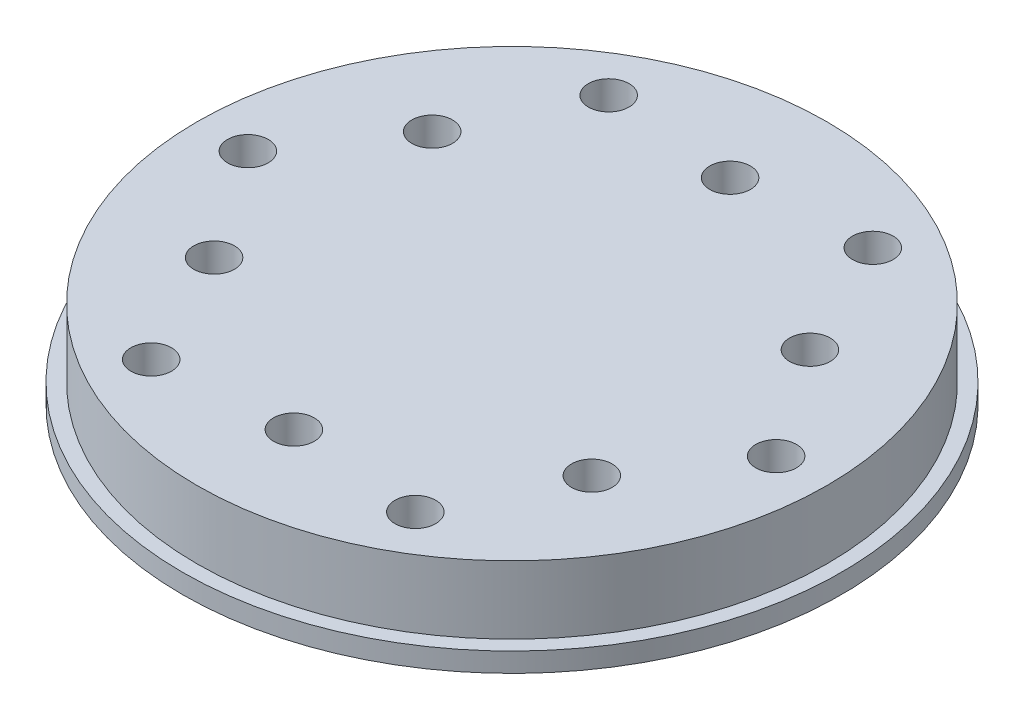
ISO-10303-21;
HEADER;
FILE_DESCRIPTION(('STEP AP214'),'2;1');
FILE_NAME('part.step','',(''),(''),'','','');
FILE_SCHEMA(('AUTOMOTIVE_DESIGN { 1 0 10303 214 1 1 1 1 }'));
ENDSEC;
DATA;
#1=APPLICATION_CONTEXT('core data for automotive mechanical design processes');
#2=APPLICATION_PROTOCOL_DEFINITION('international standard','automotive_design',2000,#1);
#3=PRODUCT_CONTEXT('',#1,'mechanical');
#4=PRODUCT('Part','Part','',(#3));
#5=PRODUCT_RELATED_PRODUCT_CATEGORY('part','',(#4));
#6=PRODUCT_DEFINITION_FORMATION('','',#4);
#7=PRODUCT_DEFINITION_CONTEXT('part definition',#1,'design');
#8=PRODUCT_DEFINITION('design','',#6,#7);
#9=PRODUCT_DEFINITION_SHAPE('','',#8);
#10=(LENGTH_UNIT() NAMED_UNIT(*) SI_UNIT(.MILLI.,.METRE.));
#11=(NAMED_UNIT(*) PLANE_ANGLE_UNIT() SI_UNIT($,.RADIAN.));
#12=(NAMED_UNIT(*) SI_UNIT($,.STERADIAN.) SOLID_ANGLE_UNIT());
#13=UNCERTAINTY_MEASURE_WITH_UNIT(LENGTH_MEASURE(1.E-05),#10,'distance_accuracy_value','');
#14=(GEOMETRIC_REPRESENTATION_CONTEXT(3) GLOBAL_UNCERTAINTY_ASSIGNED_CONTEXT((#13)) GLOBAL_UNIT_ASSIGNED_CONTEXT((#10,
#11,#12)) REPRESENTATION_CONTEXT('',''));
#15=CARTESIAN_POINT('',(0.,0.,0.));
#16=DIRECTION('',(0.,0.,1.));
#17=DIRECTION('',(1.,0.,0.));
#18=AXIS2_PLACEMENT_3D('',#15,#16,#17);
#19=CARTESIAN_POINT('',(0.,10.,0.));
#20=DIRECTION('',(0.,-1.,0.));
#21=DIRECTION('',(0.,0.,-1.));
#22=AXIS2_PLACEMENT_3D('',#19,#20,#21);
#23=CYLINDRICAL_SURFACE('',#22,32.5);
#24=CARTESIAN_POINT('',(0.,10.,0.));
#25=DIRECTION('',(0.,1.,0.));
#26=DIRECTION('',(0.,0.,1.));
#27=AXIS2_PLACEMENT_3D('',#24,#25,#26);
#28=CIRCLE('',#27,32.5);
#29=CARTESIAN_POINT('',(0.,10.,32.5));
#30=VERTEX_POINT('',#29);
#31=EDGE_CURVE('E45',#30,#30,#28,.T.);
#32=ORIENTED_EDGE('',*,*,#31,.F.);
#33=EDGE_LOOP('',(#32));
#34=FACE_BOUND('',#33,.T.);
#35=CARTESIAN_POINT('',(0.,2.99999999999996,0.));
#36=DIRECTION('',(0.,-1.,0.));
#37=DIRECTION('',(0.,0.,-1.));
#38=AXIS2_PLACEMENT_3D('',#35,#36,#37);
#39=CIRCLE('',#38,32.5);
#40=CARTESIAN_POINT('',(0.,2.99999999999991,-32.5));
#41=VERTEX_POINT('',#40);
#42=EDGE_CURVE('E10',#41,#41,#39,.T.);
#43=ORIENTED_EDGE('',*,*,#42,.F.);
#44=EDGE_LOOP('',(#43));
#45=FACE_BOUND('',#44,.T.);
#46=ADVANCED_FACE('F38',(#34,#45),#23,.T.);
#47=CARTESIAN_POINT('',(0.,0.,0.));
#48=DIRECTION('',(0.,1.,0.));
#49=DIRECTION('',(0.,0.,1.));
#50=AXIS2_PLACEMENT_3D('',#47,#48,#49);
#51=PLANE('',#50);
#52=CARTESIAN_POINT('',(0.,0.,0.));
#53=DIRECTION('',(0.,1.,0.));
#54=DIRECTION('',(0.,0.,1.));
#55=AXIS2_PLACEMENT_3D('',#52,#53,#54);
#56=CIRCLE('',#55,6.5);
#57=CARTESIAN_POINT('',(0.,0.,6.5));
#58=VERTEX_POINT('',#57);
#59=EDGE_CURVE('E49',#58,#58,#56,.T.);
#60=ORIENTED_EDGE('',*,*,#59,.T.);
#61=EDGE_LOOP('',(#60));
#62=FACE_BOUND('',#61,.T.);
#63=CARTESIAN_POINT('',(0.,0.,0.));
#64=DIRECTION('',(0.,-1.,0.));
#65=DIRECTION('',(0.,0.,-1.));
#66=AXIS2_PLACEMENT_3D('',#63,#64,#65);
#67=CIRCLE('',#66,17.5);
#68=CARTESIAN_POINT('',(0.,0.,-17.5));
#69=VERTEX_POINT('',#68);
#70=EDGE_CURVE('E94',#69,#69,#67,.T.);
#71=ORIENTED_EDGE('',*,*,#70,.T.);
#72=EDGE_LOOP('',(#71));
#73=FACE_BOUND('',#72,.T.);
#74=ADVANCED_FACE('F173',(#62,#73),#51,.F.);
#75=CARTESIAN_POINT('',(0.,10.,0.));
#76=DIRECTION('',(0.,-1.,0.));
#77=DIRECTION('',(0.,0.,-1.));
#78=AXIS2_PLACEMENT_3D('',#75,#76,#77);
#79=CYLINDRICAL_SURFACE('',#78,6.5);
#80=ORIENTED_EDGE('',*,*,#59,.F.);
#81=EDGE_LOOP('',(#80));
#82=FACE_BOUND('',#81,.T.);
#83=CARTESIAN_POINT('',(0.,3.5,0.));
#84=DIRECTION('',(0.,1.,0.));
#85=DIRECTION('',(0.,0.,1.));
#86=AXIS2_PLACEMENT_3D('',#83,#84,#85);
#87=CIRCLE('',#86,6.5);
#88=CARTESIAN_POINT('',(0.,3.5,6.5));
#89=VERTEX_POINT('',#88);
#90=EDGE_CURVE('E77',#89,#89,#87,.T.);
#91=ORIENTED_EDGE('',*,*,#90,.T.);
#92=EDGE_LOOP('',(#91));
#93=FACE_BOUND('',#92,.T.);
#94=ADVANCED_FACE('F177',(#82,#93),#79,.F.);
#95=CARTESIAN_POINT('',(0.,3.5,0.));
#96=DIRECTION('',(0.,1.,0.));
#97=DIRECTION('',(0.,0.,1.));
#98=AXIS2_PLACEMENT_3D('',#95,#96,#97);
#99=PLANE('',#98);
#100=ORIENTED_EDGE('',*,*,#90,.F.);
#101=EDGE_LOOP('',(#100));
#102=FACE_BOUND('',#101,.T.);
#103=ADVANCED_FACE('F182',(#102),#99,.F.);
#104=CARTESIAN_POINT('',(0.,1.,0.));
#105=DIRECTION('',(0.,-1.,0.));
#106=DIRECTION('',(0.,0.,-1.));
#107=AXIS2_PLACEMENT_3D('',#104,#105,#106);
#108=PLANE('',#107);
#109=CARTESIAN_POINT('',(0.,0.999999999999999,-22.5));
#110=DIRECTION('',(0.,-1.,0.));
#111=DIRECTION('',(0.,0.,-1.));
#112=AXIS2_PLACEMENT_3D('',#109,#110,#111);
#113=CIRCLE('',#112,2.1);
#114=CARTESIAN_POINT('',(0.,0.999999999999999,-24.6));
#115=VERTEX_POINT('',#114);
#116=EDGE_CURVE('E132',#115,#115,#113,.T.);
#117=ORIENTED_EDGE('',*,*,#116,.F.);
#118=EDGE_LOOP('',(#117));
#119=FACE_BOUND('',#118,.T.);
#120=CARTESIAN_POINT('',(19.4855715851499,0.999999999999999,-11.25));
#121=DIRECTION('',(0.,-1.,0.));
#122=DIRECTION('',(0.,0.,-1.));
#123=AXIS2_PLACEMENT_3D('',#120,#121,#122);
#124=CIRCLE('',#123,2.1);
#125=CARTESIAN_POINT('',(19.4855715851499,0.999999999999999,-13.35));
#126=VERTEX_POINT('',#125);
#127=EDGE_CURVE('E126',#126,#126,#124,.T.);
#128=ORIENTED_EDGE('',*,*,#127,.F.);
#129=EDGE_LOOP('',(#128));
#130=FACE_BOUND('',#129,.T.);
#131=CARTESIAN_POINT('',(19.4855715851499,0.999999999999999,11.25));
#132=DIRECTION('',(0.,-1.,0.));
#133=DIRECTION('',(0.,0.,-1.));
#134=AXIS2_PLACEMENT_3D('',#131,#132,#133);
#135=CIRCLE('',#134,2.1);
#136=CARTESIAN_POINT('',(19.4855715851499,0.999999999999999,9.15));
#137=VERTEX_POINT('',#136);
#138=EDGE_CURVE('E120',#137,#137,#135,.T.);
#139=ORIENTED_EDGE('',*,*,#138,.F.);
#140=EDGE_LOOP('',(#139));
#141=FACE_BOUND('',#140,.T.);
#142=CARTESIAN_POINT('',(0.,0.999999999999999,22.5));
#143=DIRECTION('',(0.,-1.,0.));
#144=DIRECTION('',(0.,0.,-1.));
#145=AXIS2_PLACEMENT_3D('',#142,#143,#144);
#146=CIRCLE('',#145,2.1);
#147=CARTESIAN_POINT('',(0.,0.999999999999999,20.4));
#148=VERTEX_POINT('',#147);
#149=EDGE_CURVE('E114',#148,#148,#146,.T.);
#150=ORIENTED_EDGE('',*,*,#149,.F.);
#151=EDGE_LOOP('',(#150));
#152=FACE_BOUND('',#151,.T.);
#153=CARTESIAN_POINT('',(-19.4855715851499,0.999999999999999,11.25));
#154=DIRECTION('',(0.,-1.,0.));
#155=DIRECTION('',(0.,0.,-1.));
#156=AXIS2_PLACEMENT_3D('',#153,#154,#155);
#157=CIRCLE('',#156,2.1);
#158=CARTESIAN_POINT('',(-19.4855715851499,0.999999999999999,9.15000000000001));
#159=VERTEX_POINT('',#158);
#160=EDGE_CURVE('E108',#159,#159,#157,.T.);
#161=ORIENTED_EDGE('',*,*,#160,.F.);
#162=EDGE_LOOP('',(#161));
#163=FACE_BOUND('',#162,.T.);
#164=CARTESIAN_POINT('',(-19.4855715851499,0.999999999999999,-11.25));
#165=DIRECTION('',(0.,-1.,0.));
#166=DIRECTION('',(0.,0.,-1.));
#167=AXIS2_PLACEMENT_3D('',#164,#165,#166);
#168=CIRCLE('',#167,2.1);
#169=CARTESIAN_POINT('',(-19.4855715851499,0.999999999999999,-13.35));
#170=VERTEX_POINT('',#169);
#171=EDGE_CURVE('E41',#170,#170,#168,.T.);
#172=ORIENTED_EDGE('',*,*,#171,.F.);
#173=EDGE_LOOP('',(#172));
#174=FACE_BOUND('',#173,.T.);
#175=CARTESIAN_POINT('',(0.,1.,0.));
#176=DIRECTION('',(0.,-1.,0.));
#177=DIRECTION('',(0.,0.,-1.));
#178=AXIS2_PLACEMENT_3D('',#175,#176,#177);
#179=CIRCLE('',#178,17.5);
#180=CARTESIAN_POINT('',(0.,1.,-17.5));
#181=VERTEX_POINT('',#180);
#182=EDGE_CURVE('E55',#181,#181,#179,.T.);
#183=ORIENTED_EDGE('',*,*,#182,.F.);
#184=EDGE_LOOP('',(#183));
#185=FACE_BOUND('',#184,.T.);
#186=CARTESIAN_POINT('',(-13.625,0.999999999999999,-23.5991922531259));
#187=DIRECTION('',(0.,-1.,0.));
#188=DIRECTION('',(0.,0.,-1.));
#189=AXIS2_PLACEMENT_3D('',#186,#187,#188);
#190=CIRCLE('',#189,2.1);
#191=CARTESIAN_POINT('',(-13.625,0.999999999999999,-25.6991922531259));
#192=VERTEX_POINT('',#191);
#193=EDGE_CURVE('E52',#192,#192,#190,.F.);
#194=ORIENTED_EDGE('',*,*,#193,.T.);
#195=EDGE_LOOP('',(#194));
#196=FACE_BOUND('',#195,.T.);
#197=CARTESIAN_POINT('',(13.625,0.999999999999999,-23.599192253126));
#198=DIRECTION('',(0.,-1.,0.));
#199=DIRECTION('',(0.,0.,-1.));
#200=AXIS2_PLACEMENT_3D('',#197,#198,#199);
#201=CIRCLE('',#200,2.1);
#202=CARTESIAN_POINT('',(13.625,0.999999999999999,-25.699192253126));
#203=VERTEX_POINT('',#202);
#204=EDGE_CURVE('E54',#203,#203,#201,.F.);
#205=ORIENTED_EDGE('',*,*,#204,.T.);
#206=EDGE_LOOP('',(#205));
#207=FACE_BOUND('',#206,.T.);
#208=CARTESIAN_POINT('',(27.25,0.999999999999999,0.));
#209=DIRECTION('',(0.,-1.,0.));
#210=DIRECTION('',(0.,0.,-1.));
#211=AXIS2_PLACEMENT_3D('',#208,#209,#210);
#212=CIRCLE('',#211,2.1);
#213=CARTESIAN_POINT('',(27.25,0.999999999999999,-2.10000000000001));
#214=VERTEX_POINT('',#213);
#215=EDGE_CURVE('E89',#214,#214,#212,.F.);
#216=ORIENTED_EDGE('',*,*,#215,.T.);
#217=EDGE_LOOP('',(#216));
#218=FACE_BOUND('',#217,.T.);
#219=CARTESIAN_POINT('',(13.625,0.999999999999999,23.599192253126));
#220=DIRECTION('',(0.,-1.,0.));
#221=DIRECTION('',(0.,0.,-1.));
#222=AXIS2_PLACEMENT_3D('',#219,#220,#221);
#223=CIRCLE('',#222,2.1);
#224=CARTESIAN_POINT('',(13.625,0.999999999999999,21.499192253126));
#225=VERTEX_POINT('',#224);
#226=EDGE_CURVE('E86',#225,#225,#223,.F.);
#227=ORIENTED_EDGE('',*,*,#226,.T.);
#228=EDGE_LOOP('',(#227));
#229=FACE_BOUND('',#228,.T.);
#230=CARTESIAN_POINT('',(-13.625,0.999999999999999,23.599192253126));
#231=DIRECTION('',(0.,-1.,0.));
#232=DIRECTION('',(0.,0.,-1.));
#233=AXIS2_PLACEMENT_3D('',#230,#231,#232);
#234=CIRCLE('',#233,2.1);
#235=CARTESIAN_POINT('',(-13.625,0.999999999999999,21.499192253126));
#236=VERTEX_POINT('',#235);
#237=EDGE_CURVE('E83',#236,#236,#234,.F.);
#238=ORIENTED_EDGE('',*,*,#237,.T.);
#239=EDGE_LOOP('',(#238));
#240=FACE_BOUND('',#239,.T.);
#241=CARTESIAN_POINT('',(-27.25,0.999999999999999,0.));
#242=DIRECTION('',(0.,-1.,0.));
#243=DIRECTION('',(0.,0.,-1.));
#244=AXIS2_PLACEMENT_3D('',#241,#242,#243);
#245=CIRCLE('',#244,2.1);
#246=CARTESIAN_POINT('',(-27.25,0.999999999999999,-2.09999999999995));
#247=VERTEX_POINT('',#246);
#248=EDGE_CURVE('E80',#247,#247,#245,.F.);
#249=ORIENTED_EDGE('',*,*,#248,.T.);
#250=EDGE_LOOP('',(#249));
#251=FACE_BOUND('',#250,.T.);
#252=CARTESIAN_POINT('',(0.,0.999999999999953,0.));
#253=DIRECTION('',(0.,-1.,0.));
#254=DIRECTION('',(0.,0.,-1.));
#255=AXIS2_PLACEMENT_3D('',#252,#253,#254);
#256=CIRCLE('',#255,34.);
#257=CARTESIAN_POINT('',(0.,0.999999999999907,-34.));
#258=VERTEX_POINT('',#257);
#259=EDGE_CURVE('E102',#258,#258,#256,.T.);
#260=ORIENTED_EDGE('',*,*,#259,.T.);
#261=EDGE_LOOP('',(#260));
#262=FACE_BOUND('',#261,.T.);
#263=ADVANCED_FACE('F213',(#119,#130,#141,#152,#163,#174,#185,#196,#207,#218,#229,#240,#251,
#262),#108,.T.);
#264=CARTESIAN_POINT('',(0.,1.,0.));
#265=DIRECTION('',(0.,-1.,0.));
#266=DIRECTION('',(0.,0.,-1.));
#267=AXIS2_PLACEMENT_3D('',#264,#265,#266);
#268=CYLINDRICAL_SURFACE('',#267,17.5);
#269=ORIENTED_EDGE('',*,*,#182,.T.);
#270=EDGE_LOOP('',(#269));
#271=FACE_BOUND('',#270,.T.);
#272=ORIENTED_EDGE('',*,*,#70,.F.);
#273=EDGE_LOOP('',(#272));
#274=FACE_BOUND('',#273,.T.);
#275=ADVANCED_FACE('F191',(#271,#274),#268,.T.);
#276=CARTESIAN_POINT('',(-27.25,10.,0.));
#277=DIRECTION('',(0.,1.,0.));
#278=DIRECTION('',(0.,0.,1.));
#279=AXIS2_PLACEMENT_3D('',#276,#277,#278);
#280=CYLINDRICAL_SURFACE('',#279,2.1);
#281=CARTESIAN_POINT('',(-27.25,10.,0.));
#282=DIRECTION('',(0.,1.,0.));
#283=DIRECTION('',(0.,0.,1.));
#284=AXIS2_PLACEMENT_3D('',#281,#282,#283);
#285=CIRCLE('',#284,2.1);
#286=CARTESIAN_POINT('',(-27.25,10.,2.10000000000004));
#287=VERTEX_POINT('',#286);
#288=EDGE_CURVE('E59',#287,#287,#285,.T.);
#289=ORIENTED_EDGE('',*,*,#288,.T.);
#290=EDGE_LOOP('',(#289));
#291=FACE_BOUND('',#290,.T.);
#292=ORIENTED_EDGE('',*,*,#248,.F.);
#293=EDGE_LOOP('',(#292));
#294=FACE_BOUND('',#293,.T.);
#295=ADVANCED_FACE('F187',(#291,#294),#280,.F.);
#296=CARTESIAN_POINT('',(-13.625,10.,23.599192253126));
#297=DIRECTION('',(0.,1.,0.));
#298=DIRECTION('',(0.,0.,1.));
#299=AXIS2_PLACEMENT_3D('',#296,#297,#298);
#300=CYLINDRICAL_SURFACE('',#299,2.1);
#301=CARTESIAN_POINT('',(-13.625,10.,23.599192253126));
#302=DIRECTION('',(0.,1.,0.));
#303=DIRECTION('',(0.,0.,1.));
#304=AXIS2_PLACEMENT_3D('',#301,#302,#303);
#305=CIRCLE('',#304,2.1);
#306=CARTESIAN_POINT('',(-13.625,10.,25.699192253126));
#307=VERTEX_POINT('',#306);
#308=EDGE_CURVE('E62',#307,#307,#305,.T.);
#309=ORIENTED_EDGE('',*,*,#308,.T.);
#310=EDGE_LOOP('',(#309));
#311=FACE_BOUND('',#310,.T.);
#312=ORIENTED_EDGE('',*,*,#237,.F.);
#313=EDGE_LOOP('',(#312));
#314=FACE_BOUND('',#313,.T.);
#315=ADVANCED_FACE('F190',(#311,#314),#300,.F.);
#316=CARTESIAN_POINT('',(13.625,10.,23.599192253126));
#317=DIRECTION('',(0.,1.,0.));
#318=DIRECTION('',(0.,0.,1.));
#319=AXIS2_PLACEMENT_3D('',#316,#317,#318);
#320=CYLINDRICAL_SURFACE('',#319,2.1);
#321=CARTESIAN_POINT('',(13.625,10.,23.599192253126));
#322=DIRECTION('',(0.,1.,0.));
#323=DIRECTION('',(0.,0.,1.));
#324=AXIS2_PLACEMENT_3D('',#321,#322,#323);
#325=CIRCLE('',#324,2.1);
#326=CARTESIAN_POINT('',(13.625,10.,25.699192253126));
#327=VERTEX_POINT('',#326);
#328=EDGE_CURVE('E65',#327,#327,#325,.T.);
#329=ORIENTED_EDGE('',*,*,#328,.T.);
#330=EDGE_LOOP('',(#329));
#331=FACE_BOUND('',#330,.T.);
#332=ORIENTED_EDGE('',*,*,#226,.F.);
#333=EDGE_LOOP('',(#332));
#334=FACE_BOUND('',#333,.T.);
#335=ADVANCED_FACE('F195',(#331,#334),#320,.F.);
#336=CARTESIAN_POINT('',(27.25,10.,0.));
#337=DIRECTION('',(0.,1.,0.));
#338=DIRECTION('',(0.,0.,1.));
#339=AXIS2_PLACEMENT_3D('',#336,#337,#338);
#340=CYLINDRICAL_SURFACE('',#339,2.1);
#341=CARTESIAN_POINT('',(27.25,10.,0.));
#342=DIRECTION('',(0.,1.,0.));
#343=DIRECTION('',(0.,0.,1.));
#344=AXIS2_PLACEMENT_3D('',#341,#342,#343);
#345=CIRCLE('',#344,2.1);
#346=CARTESIAN_POINT('',(27.25,10.,2.09999999999998));
#347=VERTEX_POINT('',#346);
#348=EDGE_CURVE('E68',#347,#347,#345,.T.);
#349=ORIENTED_EDGE('',*,*,#348,.T.);
#350=EDGE_LOOP('',(#349));
#351=FACE_BOUND('',#350,.T.);
#352=ORIENTED_EDGE('',*,*,#215,.F.);
#353=EDGE_LOOP('',(#352));
#354=FACE_BOUND('',#353,.T.);
#355=ADVANCED_FACE('F199',(#351,#354),#340,.F.);
#356=CARTESIAN_POINT('',(13.625,10.,-23.599192253126));
#357=DIRECTION('',(0.,1.,0.));
#358=DIRECTION('',(0.,0.,1.));
#359=AXIS2_PLACEMENT_3D('',#356,#357,#358);
#360=CYLINDRICAL_SURFACE('',#359,2.1);
#361=CARTESIAN_POINT('',(13.625,10.,-23.599192253126));
#362=DIRECTION('',(0.,1.,0.));
#363=DIRECTION('',(0.,0.,1.));
#364=AXIS2_PLACEMENT_3D('',#361,#362,#363);
#365=CIRCLE('',#364,2.1);
#366=CARTESIAN_POINT('',(13.625,10.,-21.499192253126));
#367=VERTEX_POINT('',#366);
#368=EDGE_CURVE('E71',#367,#367,#365,.T.);
#369=ORIENTED_EDGE('',*,*,#368,.T.);
#370=EDGE_LOOP('',(#369));
#371=FACE_BOUND('',#370,.T.);
#372=ORIENTED_EDGE('',*,*,#204,.F.);
#373=EDGE_LOOP('',(#372));
#374=FACE_BOUND('',#373,.T.);
#375=ADVANCED_FACE('F145',(#371,#374),#360,.F.);
#376=CARTESIAN_POINT('',(0.,10.,0.));
#377=DIRECTION('',(0.,1.,0.));
#378=DIRECTION('',(0.,0.,1.));
#379=AXIS2_PLACEMENT_3D('',#376,#377,#378);
#380=PLANE('',#379);
#381=CARTESIAN_POINT('',(0.,10.,-22.5));
#382=DIRECTION('',(0.,1.,0.));
#383=DIRECTION('',(0.,0.,1.));
#384=AXIS2_PLACEMENT_3D('',#381,#382,#383);
#385=CIRCLE('',#384,2.1);
#386=CARTESIAN_POINT('',(0.,10.,-20.4));
#387=VERTEX_POINT('',#386);
#388=EDGE_CURVE('E135',#387,#387,#385,.T.);
#389=ORIENTED_EDGE('',*,*,#388,.F.);
#390=EDGE_LOOP('',(#389));
#391=FACE_BOUND('',#390,.T.);
#392=CARTESIAN_POINT('',(19.4855715851499,10.,-11.25));
#393=DIRECTION('',(0.,1.,0.));
#394=DIRECTION('',(0.,0.,1.));
#395=AXIS2_PLACEMENT_3D('',#392,#393,#394);
#396=CIRCLE('',#395,2.1);
#397=CARTESIAN_POINT('',(19.4855715851499,10.,-9.15));
#398=VERTEX_POINT('',#397);
#399=EDGE_CURVE('E129',#398,#398,#396,.T.);
#400=ORIENTED_EDGE('',*,*,#399,.F.);
#401=EDGE_LOOP('',(#400));
#402=FACE_BOUND('',#401,.T.);
#403=CARTESIAN_POINT('',(19.4855715851499,10.,11.25));
#404=DIRECTION('',(0.,1.,0.));
#405=DIRECTION('',(0.,0.,1.));
#406=AXIS2_PLACEMENT_3D('',#403,#404,#405);
#407=CIRCLE('',#406,2.1);
#408=CARTESIAN_POINT('',(19.4855715851499,10.,13.35));
#409=VERTEX_POINT('',#408);
#410=EDGE_CURVE('E123',#409,#409,#407,.T.);
#411=ORIENTED_EDGE('',*,*,#410,.F.);
#412=EDGE_LOOP('',(#411));
#413=FACE_BOUND('',#412,.T.);
#414=CARTESIAN_POINT('',(0.,10.,22.5));
#415=DIRECTION('',(0.,1.,0.));
#416=DIRECTION('',(0.,0.,1.));
#417=AXIS2_PLACEMENT_3D('',#414,#415,#416);
#418=CIRCLE('',#417,2.1);
#419=CARTESIAN_POINT('',(0.,10.,24.6));
#420=VERTEX_POINT('',#419);
#421=EDGE_CURVE('E117',#420,#420,#418,.T.);
#422=ORIENTED_EDGE('',*,*,#421,.F.);
#423=EDGE_LOOP('',(#422));
#424=FACE_BOUND('',#423,.T.);
#425=CARTESIAN_POINT('',(-19.4855715851499,10.,11.25));
#426=DIRECTION('',(0.,1.,0.));
#427=DIRECTION('',(0.,0.,1.));
#428=AXIS2_PLACEMENT_3D('',#425,#426,#427);
#429=CIRCLE('',#428,2.1);
#430=CARTESIAN_POINT('',(-19.4855715851499,10.,13.35));
#431=VERTEX_POINT('',#430);
#432=EDGE_CURVE('E111',#431,#431,#429,.T.);
#433=ORIENTED_EDGE('',*,*,#432,.F.);
#434=EDGE_LOOP('',(#433));
#435=FACE_BOUND('',#434,.T.);
#436=CARTESIAN_POINT('',(-19.4855715851499,10.,-11.25));
#437=DIRECTION('',(0.,1.,0.));
#438=DIRECTION('',(0.,0.,1.));
#439=AXIS2_PLACEMENT_3D('',#436,#437,#438);
#440=CIRCLE('',#439,2.1);
#441=CARTESIAN_POINT('',(-19.4855715851499,10.,-9.15));
#442=VERTEX_POINT('',#441);
#443=EDGE_CURVE('E105',#442,#442,#440,.T.);
#444=ORIENTED_EDGE('',*,*,#443,.F.);
#445=EDGE_LOOP('',(#444));
#446=FACE_BOUND('',#445,.T.);
#447=CARTESIAN_POINT('',(-13.625,10.,-23.5991922531259));
#448=DIRECTION('',(0.,1.,0.));
#449=DIRECTION('',(0.,0.,1.));
#450=AXIS2_PLACEMENT_3D('',#447,#448,#449);
#451=CIRCLE('',#450,2.1);
#452=CARTESIAN_POINT('',(-13.625,10.,-21.4991922531259));
#453=VERTEX_POINT('',#452);
#454=EDGE_CURVE('E74',#453,#453,#451,.T.);
#455=ORIENTED_EDGE('',*,*,#454,.F.);
#456=EDGE_LOOP('',(#455));
#457=FACE_BOUND('',#456,.T.);
#458=ORIENTED_EDGE('',*,*,#368,.F.);
#459=EDGE_LOOP('',(#458));
#460=FACE_BOUND('',#459,.T.);
#461=ORIENTED_EDGE('',*,*,#348,.F.);
#462=EDGE_LOOP('',(#461));
#463=FACE_BOUND('',#462,.T.);
#464=ORIENTED_EDGE('',*,*,#328,.F.);
#465=EDGE_LOOP('',(#464));
#466=FACE_BOUND('',#465,.T.);
#467=ORIENTED_EDGE('',*,*,#308,.F.);
#468=EDGE_LOOP('',(#467));
#469=FACE_BOUND('',#468,.T.);
#470=ORIENTED_EDGE('',*,*,#288,.F.);
#471=EDGE_LOOP('',(#470));
#472=FACE_BOUND('',#471,.T.);
#473=ORIENTED_EDGE('',*,*,#31,.T.);
#474=EDGE_LOOP('',(#473));
#475=FACE_BOUND('',#474,.T.);
#476=ADVANCED_FACE('F141',(#391,#402,#413,#424,#435,#446,#457,#460,#463,#466,#469,#472,#475),
#380,.T.);
#477=CARTESIAN_POINT('',(-13.625,10.,-23.5991922531259));
#478=DIRECTION('',(0.,1.,0.));
#479=DIRECTION('',(0.,0.,1.));
#480=AXIS2_PLACEMENT_3D('',#477,#478,#479);
#481=CYLINDRICAL_SURFACE('',#480,2.1);
#482=ORIENTED_EDGE('',*,*,#454,.T.);
#483=EDGE_LOOP('',(#482));
#484=FACE_BOUND('',#483,.T.);
#485=ORIENTED_EDGE('',*,*,#193,.F.);
#486=EDGE_LOOP('',(#485));
#487=FACE_BOUND('',#486,.T.);
#488=ADVANCED_FACE('F144',(#484,#487),#481,.F.);
#489=CARTESIAN_POINT('',(0.,3.,32.5));
#490=DIRECTION('',(0.,-1.,0.));
#491=DIRECTION('',(0.,0.,-1.));
#492=AXIS2_PLACEMENT_3D('',#489,#490,#491);
#493=PLANE('',#492);
#494=CARTESIAN_POINT('',(0.,2.99999999999995,0.));
#495=DIRECTION('',(0.,-1.,0.));
#496=DIRECTION('',(0.,0.,-1.));
#497=AXIS2_PLACEMENT_3D('',#494,#495,#496);
#498=CIRCLE('',#497,34.);
#499=CARTESIAN_POINT('',(0.,2.99999999999991,-34.));
#500=VERTEX_POINT('',#499);
#501=EDGE_CURVE('E97',#500,#500,#498,.T.);
#502=ORIENTED_EDGE('',*,*,#501,.F.);
#503=EDGE_LOOP('',(#502));
#504=FACE_BOUND('',#503,.T.);
#505=ORIENTED_EDGE('',*,*,#42,.T.);
#506=EDGE_LOOP('',(#505));
#507=FACE_BOUND('',#506,.T.);
#508=ADVANCED_FACE('F209',(#504,#507),#493,.F.);
#509=CARTESIAN_POINT('',(0.,0.,0.));
#510=DIRECTION('',(0.,-1.,0.));
#511=DIRECTION('',(0.,0.,-1.));
#512=AXIS2_PLACEMENT_3D('',#509,#510,#511);
#513=CYLINDRICAL_SURFACE('',#512,34.);
#514=ORIENTED_EDGE('',*,*,#259,.F.);
#515=EDGE_LOOP('',(#514));
#516=FACE_BOUND('',#515,.T.);
#517=ORIENTED_EDGE('',*,*,#501,.T.);
#518=EDGE_LOOP('',(#517));
#519=FACE_BOUND('',#518,.T.);
#520=ADVANCED_FACE('F223',(#516,#519),#513,.T.);
#521=CARTESIAN_POINT('',(-19.4855715851499,10.,-11.25));
#522=DIRECTION('',(0.,1.,0.));
#523=DIRECTION('',(0.,0.,1.));
#524=AXIS2_PLACEMENT_3D('',#521,#522,#523);
#525=CYLINDRICAL_SURFACE('',#524,2.1);
#526=ORIENTED_EDGE('',*,*,#171,.T.);
#527=EDGE_LOOP('',(#526));
#528=FACE_BOUND('',#527,.T.);
#529=ORIENTED_EDGE('',*,*,#443,.T.);
#530=EDGE_LOOP('',(#529));
#531=FACE_BOUND('',#530,.T.);
#532=ADVANCED_FACE('F227',(#528,#531),#525,.F.);
#533=CARTESIAN_POINT('',(-19.4855715851499,10.,11.25));
#534=DIRECTION('',(0.,1.,0.));
#535=DIRECTION('',(0.,0.,1.));
#536=AXIS2_PLACEMENT_3D('',#533,#534,#535);
#537=CYLINDRICAL_SURFACE('',#536,2.1);
#538=ORIENTED_EDGE('',*,*,#160,.T.);
#539=EDGE_LOOP('',(#538));
#540=FACE_BOUND('',#539,.T.);
#541=ORIENTED_EDGE('',*,*,#432,.T.);
#542=EDGE_LOOP('',(#541));
#543=FACE_BOUND('',#542,.T.);
#544=ADVANCED_FACE('F231',(#540,#543),#537,.F.);
#545=CARTESIAN_POINT('',(0.,10.,22.5));
#546=DIRECTION('',(0.,1.,0.));
#547=DIRECTION('',(0.,0.,1.));
#548=AXIS2_PLACEMENT_3D('',#545,#546,#547);
#549=CYLINDRICAL_SURFACE('',#548,2.1);
#550=ORIENTED_EDGE('',*,*,#149,.T.);
#551=EDGE_LOOP('',(#550));
#552=FACE_BOUND('',#551,.T.);
#553=ORIENTED_EDGE('',*,*,#421,.T.);
#554=EDGE_LOOP('',(#553));
#555=FACE_BOUND('',#554,.T.);
#556=ADVANCED_FACE('F235',(#552,#555),#549,.F.);
#557=CARTESIAN_POINT('',(19.4855715851499,10.,11.25));
#558=DIRECTION('',(0.,1.,0.));
#559=DIRECTION('',(0.,0.,1.));
#560=AXIS2_PLACEMENT_3D('',#557,#558,#559);
#561=CYLINDRICAL_SURFACE('',#560,2.1);
#562=ORIENTED_EDGE('',*,*,#138,.T.);
#563=EDGE_LOOP('',(#562));
#564=FACE_BOUND('',#563,.T.);
#565=ORIENTED_EDGE('',*,*,#410,.T.);
#566=EDGE_LOOP('',(#565));
#567=FACE_BOUND('',#566,.T.);
#568=ADVANCED_FACE('F239',(#564,#567),#561,.F.);
#569=CARTESIAN_POINT('',(19.4855715851499,10.,-11.25));
#570=DIRECTION('',(0.,1.,0.));
#571=DIRECTION('',(0.,0.,1.));
#572=AXIS2_PLACEMENT_3D('',#569,#570,#571);
#573=CYLINDRICAL_SURFACE('',#572,2.1);
#574=ORIENTED_EDGE('',*,*,#127,.T.);
#575=EDGE_LOOP('',(#574));
#576=FACE_BOUND('',#575,.T.);
#577=ORIENTED_EDGE('',*,*,#399,.T.);
#578=EDGE_LOOP('',(#577));
#579=FACE_BOUND('',#578,.T.);
#580=ADVANCED_FACE('F243',(#576,#579),#573,.F.);
#581=CARTESIAN_POINT('',(0.,10.,-22.5));
#582=DIRECTION('',(0.,1.,0.));
#583=DIRECTION('',(0.,0.,1.));
#584=AXIS2_PLACEMENT_3D('',#581,#582,#583);
#585=CYLINDRICAL_SURFACE('',#584,2.1);
#586=ORIENTED_EDGE('',*,*,#116,.T.);
#587=EDGE_LOOP('',(#586));
#588=FACE_BOUND('',#587,.T.);
#589=ORIENTED_EDGE('',*,*,#388,.T.);
#590=EDGE_LOOP('',(#589));
#591=FACE_BOUND('',#590,.T.);
#592=ADVANCED_FACE('F139',(#588,#591),#585,.F.);
#593=CLOSED_SHELL('',(#46,#74,#94,#103,#263,#275,#295,#315,#335,#355,#375,#476,#488,#508,#520,
#532,#544,#556,#568,#580,#592));
#594=MANIFOLD_SOLID_BREP('B2',#593);
#595=ADVANCED_BREP_SHAPE_REPRESENTATION('',(#18,#594),#14);
#596=SHAPE_DEFINITION_REPRESENTATION(#9,#595);
ENDSEC;
END-ISO-10303-21;
